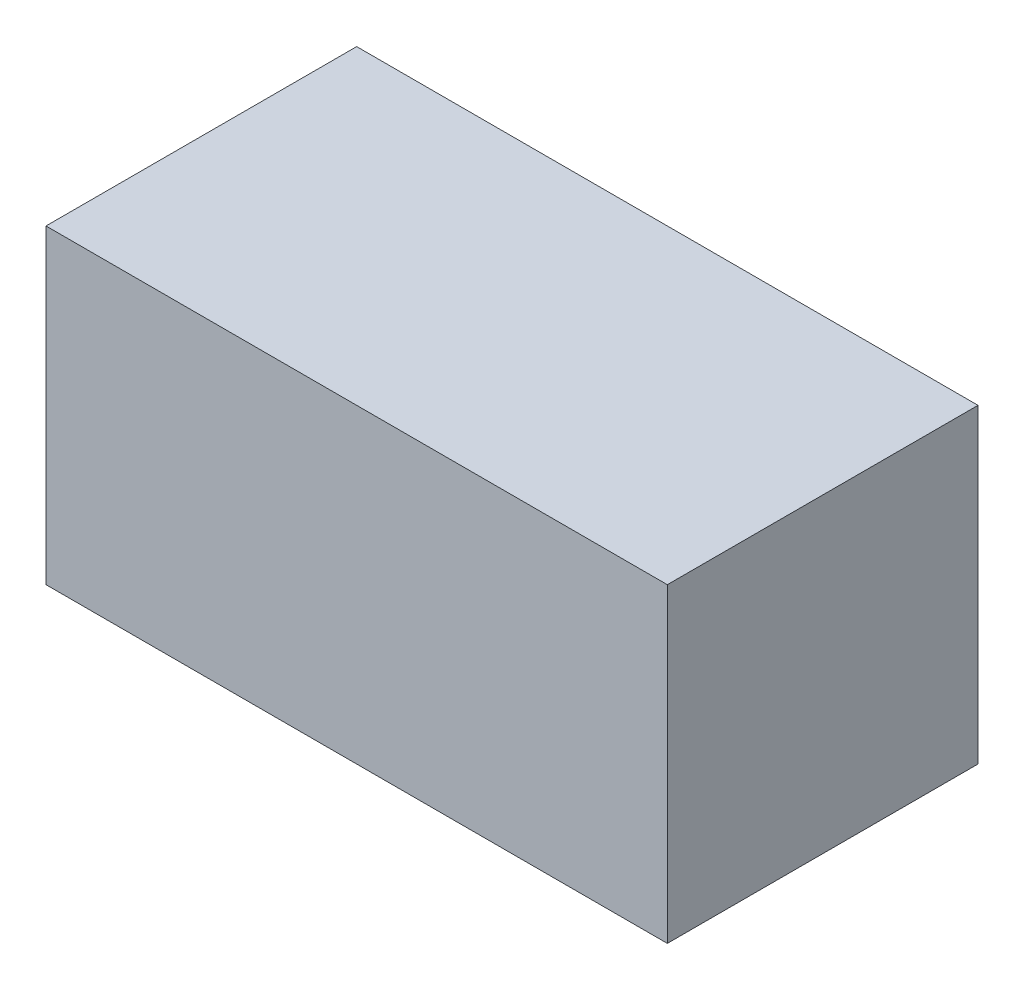
ISO-10303-21;
HEADER;
FILE_DESCRIPTION(('STEP AP214'),'2;1');
FILE_NAME('part.step','',(''),(''),'','','');
FILE_SCHEMA(('AUTOMOTIVE_DESIGN { 1 0 10303 214 1 1 1 1 }'));
ENDSEC;
DATA;
#1=APPLICATION_CONTEXT('core data for automotive mechanical design processes');
#2=APPLICATION_PROTOCOL_DEFINITION('international standard','automotive_design',2000,#1);
#3=PRODUCT_CONTEXT('',#1,'mechanical');
#4=PRODUCT('Part','Part','',(#3));
#5=PRODUCT_RELATED_PRODUCT_CATEGORY('part','',(#4));
#6=PRODUCT_DEFINITION_FORMATION('','',#4);
#7=PRODUCT_DEFINITION_CONTEXT('part definition',#1,'design');
#8=PRODUCT_DEFINITION('design','',#6,#7);
#9=PRODUCT_DEFINITION_SHAPE('','',#8);
#10=(LENGTH_UNIT() NAMED_UNIT(*) SI_UNIT(.MILLI.,.METRE.));
#11=(NAMED_UNIT(*) PLANE_ANGLE_UNIT() SI_UNIT($,.RADIAN.));
#12=(NAMED_UNIT(*) SI_UNIT($,.STERADIAN.) SOLID_ANGLE_UNIT());
#13=UNCERTAINTY_MEASURE_WITH_UNIT(LENGTH_MEASURE(1.E-05),#10,'distance_accuracy_value','');
#14=(GEOMETRIC_REPRESENTATION_CONTEXT(3) GLOBAL_UNCERTAINTY_ASSIGNED_CONTEXT((#13)) GLOBAL_UNIT_ASSIGNED_CONTEXT((#10,
#11,#12)) REPRESENTATION_CONTEXT('',''));
#15=CARTESIAN_POINT('',(0.,0.,0.));
#16=DIRECTION('',(0.,0.,1.));
#17=DIRECTION('',(1.,0.,0.));
#18=AXIS2_PLACEMENT_3D('',#15,#16,#17);
#19=CARTESIAN_POINT('',(0.,20.,10.));
#20=DIRECTION('',(1.,0.,0.));
#21=DIRECTION('',(0.,0.,-1.));
#22=AXIS2_PLACEMENT_3D('',#19,#20,#21);
#23=PLANE('',#22);
#24=DIRECTION('',(0.,-1.,0.));
#25=VECTOR('',#24,1.);
#26=CARTESIAN_POINT('',(0.,20.,-10.));
#27=LINE('',#26,#25);
#28=CARTESIAN_POINT('',(0.,20.,-10.));
#29=VERTEX_POINT('',#28);
#30=CARTESIAN_POINT('',(0.,0.,-10.));
#31=VERTEX_POINT('',#30);
#32=EDGE_CURVE('E105',#29,#31,#27,.T.);
#33=ORIENTED_EDGE('',*,*,#32,.T.);
#34=DIRECTION('',(0.,0.,-1.));
#35=VECTOR('',#34,1.);
#36=CARTESIAN_POINT('',(0.,0.,10.));
#37=LINE('',#36,#35);
#38=CARTESIAN_POINT('',(0.,0.,10.));
#39=VERTEX_POINT('',#38);
#40=EDGE_CURVE('E11',#39,#31,#37,.T.);
#41=ORIENTED_EDGE('',*,*,#40,.F.);
#42=DIRECTION('',(0.,-1.,0.));
#43=VECTOR('',#42,1.);
#44=CARTESIAN_POINT('',(0.,20.,10.));
#45=LINE('',#44,#43);
#46=CARTESIAN_POINT('',(0.,20.,10.));
#47=VERTEX_POINT('',#46);
#48=EDGE_CURVE('E93',#47,#39,#45,.T.);
#49=ORIENTED_EDGE('',*,*,#48,.F.);
#50=DIRECTION('',(0.,0.,-1.));
#51=VECTOR('',#50,1.);
#52=CARTESIAN_POINT('',(0.,20.,10.));
#53=LINE('',#52,#51);
#54=EDGE_CURVE('E101',#47,#29,#53,.T.);
#55=ORIENTED_EDGE('',*,*,#54,.T.);
#56=EDGE_LOOP('',(#33,#41,#49,#55));
#57=FACE_BOUND('',#56,.T.);
#58=ADVANCED_FACE('F42',(#57),#23,.F.);
#59=CARTESIAN_POINT('',(0.,0.,10.));
#60=DIRECTION('',(0.,1.,0.));
#61=DIRECTION('',(0.,0.,1.));
#62=AXIS2_PLACEMENT_3D('',#59,#60,#61);
#63=PLANE('',#62);
#64=DIRECTION('',(1.,0.,0.));
#65=VECTOR('',#64,1.);
#66=CARTESIAN_POINT('',(0.,0.,-10.));
#67=LINE('',#66,#65);
#68=CARTESIAN_POINT('',(40.,0.,-10.));
#69=VERTEX_POINT('',#68);
#70=EDGE_CURVE('E97',#31,#69,#67,.T.);
#71=ORIENTED_EDGE('',*,*,#70,.T.);
#72=DIRECTION('',(0.,0.,-1.));
#73=VECTOR('',#72,1.);
#74=CARTESIAN_POINT('',(40.,0.,10.));
#75=LINE('',#74,#73);
#76=CARTESIAN_POINT('',(40.,0.,10.));
#77=VERTEX_POINT('',#76);
#78=EDGE_CURVE('E50',#77,#69,#75,.T.);
#79=ORIENTED_EDGE('',*,*,#78,.F.);
#80=DIRECTION('',(1.,0.,0.));
#81=VECTOR('',#80,1.);
#82=CARTESIAN_POINT('',(0.,0.,10.));
#83=LINE('',#82,#81);
#84=EDGE_CURVE('E88',#39,#77,#83,.T.);
#85=ORIENTED_EDGE('',*,*,#84,.F.);
#86=ORIENTED_EDGE('',*,*,#40,.T.);
#87=EDGE_LOOP('',(#71,#79,#85,#86));
#88=FACE_BOUND('',#87,.T.);
#89=ADVANCED_FACE('F96',(#88),#63,.F.);
#90=CARTESIAN_POINT('',(40.,0.,10.));
#91=DIRECTION('',(-1.,0.,0.));
#92=DIRECTION('',(0.,0.,1.));
#93=AXIS2_PLACEMENT_3D('',#90,#91,#92);
#94=PLANE('',#93);
#95=DIRECTION('',(0.,1.,0.));
#96=VECTOR('',#95,1.);
#97=CARTESIAN_POINT('',(40.,0.,-10.));
#98=LINE('',#97,#96);
#99=CARTESIAN_POINT('',(40.,20.,-10.));
#100=VERTEX_POINT('',#99);
#101=EDGE_CURVE('E75',#69,#100,#98,.T.);
#102=ORIENTED_EDGE('',*,*,#101,.T.);
#103=DIRECTION('',(0.,0.,-1.));
#104=VECTOR('',#103,1.);
#105=CARTESIAN_POINT('',(40.,20.,10.));
#106=LINE('',#105,#104);
#107=CARTESIAN_POINT('',(40.,20.,10.));
#108=VERTEX_POINT('',#107);
#109=EDGE_CURVE('E98',#108,#100,#106,.T.);
#110=ORIENTED_EDGE('',*,*,#109,.F.);
#111=DIRECTION('',(0.,1.,0.));
#112=VECTOR('',#111,1.);
#113=CARTESIAN_POINT('',(40.,0.,10.));
#114=LINE('',#113,#112);
#115=EDGE_CURVE('E91',#77,#108,#114,.T.);
#116=ORIENTED_EDGE('',*,*,#115,.F.);
#117=ORIENTED_EDGE('',*,*,#78,.T.);
#118=EDGE_LOOP('',(#102,#110,#116,#117));
#119=FACE_BOUND('',#118,.T.);
#120=ADVANCED_FACE('F99',(#119),#94,.F.);
#121=CARTESIAN_POINT('',(40.,20.,10.));
#122=DIRECTION('',(0.,-1.,0.));
#123=DIRECTION('',(0.,0.,-1.));
#124=AXIS2_PLACEMENT_3D('',#121,#122,#123);
#125=PLANE('',#124);
#126=DIRECTION('',(-1.,0.,0.));
#127=VECTOR('',#126,1.);
#128=CARTESIAN_POINT('',(40.,20.,-10.));
#129=LINE('',#128,#127);
#130=EDGE_CURVE('E81',#100,#29,#129,.T.);
#131=ORIENTED_EDGE('',*,*,#130,.T.);
#132=ORIENTED_EDGE('',*,*,#54,.F.);
#133=DIRECTION('',(-1.,0.,0.));
#134=VECTOR('',#133,1.);
#135=CARTESIAN_POINT('',(40.,20.,10.));
#136=LINE('',#135,#134);
#137=EDGE_CURVE('E58',#108,#47,#136,.T.);
#138=ORIENTED_EDGE('',*,*,#137,.F.);
#139=ORIENTED_EDGE('',*,*,#109,.T.);
#140=EDGE_LOOP('',(#131,#132,#138,#139));
#141=FACE_BOUND('',#140,.T.);
#142=ADVANCED_FACE('F113',(#141),#125,.F.);
#143=CARTESIAN_POINT('',(0.,0.,10.));
#144=DIRECTION('',(0.,0.,1.));
#145=DIRECTION('',(1.,0.,0.));
#146=AXIS2_PLACEMENT_3D('',#143,#144,#145);
#147=PLANE('',#146);
#148=ORIENTED_EDGE('',*,*,#48,.T.);
#149=ORIENTED_EDGE('',*,*,#84,.T.);
#150=ORIENTED_EDGE('',*,*,#115,.T.);
#151=ORIENTED_EDGE('',*,*,#137,.T.);
#152=EDGE_LOOP('',(#148,#149,#150,#151));
#153=FACE_BOUND('',#152,.T.);
#154=ADVANCED_FACE('F89',(#153),#147,.T.);
#155=CARTESIAN_POINT('',(0.,0.,-10.));
#156=DIRECTION('',(0.,0.,1.));
#157=DIRECTION('',(1.,0.,0.));
#158=AXIS2_PLACEMENT_3D('',#155,#156,#157);
#159=PLANE('',#158);
#160=ORIENTED_EDGE('',*,*,#32,.F.);
#161=ORIENTED_EDGE('',*,*,#130,.F.);
#162=ORIENTED_EDGE('',*,*,#101,.F.);
#163=ORIENTED_EDGE('',*,*,#70,.F.);
#164=EDGE_LOOP('',(#160,#161,#162,#163));
#165=FACE_BOUND('',#164,.T.);
#166=ADVANCED_FACE('F116',(#165),#159,.F.);
#167=CLOSED_SHELL('',(#58,#89,#120,#142,#154,#166));
#168=CARTESIAN_POINT('',(20.,10.,-5.));
#169=DIRECTION('',(0.,0.,1.));
#170=DIRECTION('',(1.,0.,0.));
#171=AXIS2_PLACEMENT_3D('',#168,#169,#170);
#172=CYLINDRICAL_SURFACE('',#171,4.);
#173=CARTESIAN_POINT('',(20.,10.,-5.));
#174=DIRECTION('',(0.,0.,1.));
#175=DIRECTION('',(1.,0.,0.));
#176=AXIS2_PLACEMENT_3D('',#173,#174,#175);
#177=CIRCLE('',#176,4.);
#178=CARTESIAN_POINT('',(24.,10.,-5.));
#179=VERTEX_POINT('',#178);
#180=EDGE_CURVE('E108',#179,#179,#177,.T.);
#181=ORIENTED_EDGE('',*,*,#180,.F.);
#182=EDGE_LOOP('',(#181));
#183=FACE_BOUND('',#182,.T.);
#184=CARTESIAN_POINT('',(20.,10.,0.));
#185=DIRECTION('',(0.,0.,1.));
#186=DIRECTION('',(1.,0.,0.));
#187=AXIS2_PLACEMENT_3D('',#184,#185,#186);
#188=CIRCLE('',#187,4.);
#189=CARTESIAN_POINT('',(24.,10.,0.));
#190=VERTEX_POINT('',#189);
#191=EDGE_CURVE('E119',#190,#190,#188,.T.);
#192=ORIENTED_EDGE('',*,*,#191,.T.);
#193=EDGE_LOOP('',(#192));
#194=FACE_BOUND('',#193,.T.);
#195=ADVANCED_FACE('F127',(#183,#194),#172,.F.);
#196=CARTESIAN_POINT('',(20.,10.,-5.));
#197=DIRECTION('',(0.,0.,1.));
#198=DIRECTION('',(1.,0.,0.));
#199=AXIS2_PLACEMENT_3D('',#196,#197,#198);
#200=PLANE('',#199);
#201=ORIENTED_EDGE('',*,*,#180,.T.);
#202=EDGE_LOOP('',(#201));
#203=FACE_BOUND('',#202,.T.);
#204=ADVANCED_FACE('F125',(#203),#200,.T.);
#205=CARTESIAN_POINT('',(20.,10.,0.));
#206=DIRECTION('',(0.,0.,1.));
#207=DIRECTION('',(1.,0.,0.));
#208=AXIS2_PLACEMENT_3D('',#205,#206,#207);
#209=PLANE('',#208);
#210=ORIENTED_EDGE('',*,*,#191,.F.);
#211=EDGE_LOOP('',(#210));
#212=FACE_BOUND('',#211,.T.);
#213=ADVANCED_FACE('F134',(#212),#209,.F.);
#214=CLOSED_SHELL('',(#195,#204,#213));
#215=ORIENTED_CLOSED_SHELL('',*,#214,.T.);
#216=BREP_WITH_VOIDS('B2',#167,(#215));
#217=ADVANCED_BREP_SHAPE_REPRESENTATION('',(#18,#216),#14);
#218=SHAPE_DEFINITION_REPRESENTATION(#9,#217);
ENDSEC;
END-ISO-10303-21;
